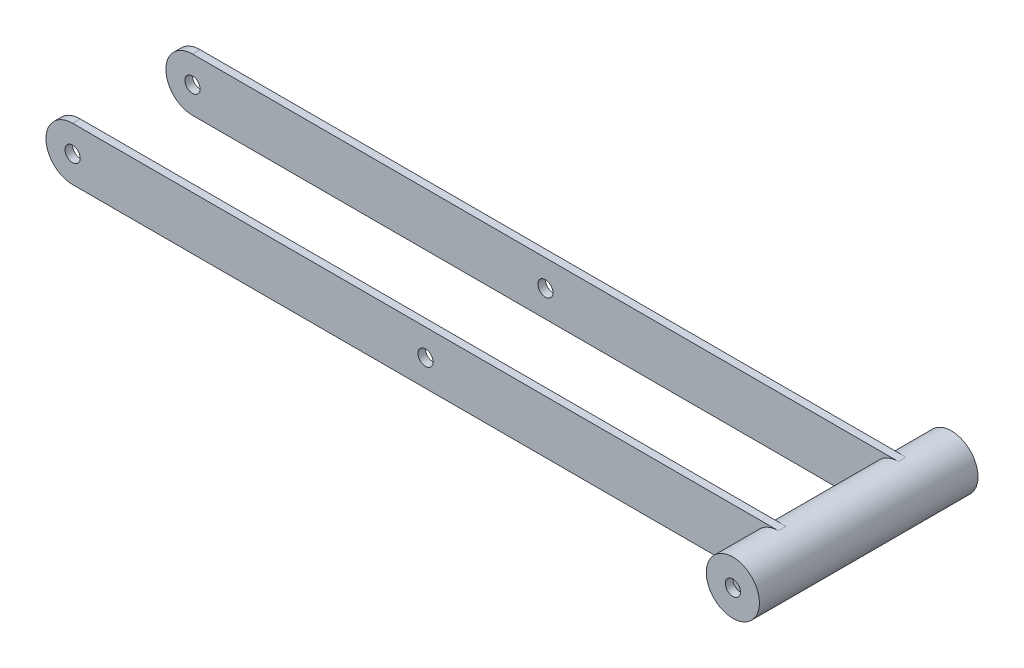
ISO-10303-21;
HEADER;
FILE_DESCRIPTION(('STEP AP214'),'2;1');
FILE_NAME('part.step','',(''),(''),'','','');
FILE_SCHEMA(('AUTOMOTIVE_DESIGN { 1 0 10303 214 1 1 1 1 }'));
ENDSEC;
DATA;
#1=APPLICATION_CONTEXT('core data for automotive mechanical design processes');
#2=APPLICATION_PROTOCOL_DEFINITION('international standard','automotive_design',2000,#1);
#3=PRODUCT_CONTEXT('',#1,'mechanical');
#4=PRODUCT('Part','Part','',(#3));
#5=PRODUCT_RELATED_PRODUCT_CATEGORY('part','',(#4));
#6=PRODUCT_DEFINITION_FORMATION('','',#4);
#7=PRODUCT_DEFINITION_CONTEXT('part definition',#1,'design');
#8=PRODUCT_DEFINITION('design','',#6,#7);
#9=PRODUCT_DEFINITION_SHAPE('','',#8);
#10=(LENGTH_UNIT() NAMED_UNIT(*) SI_UNIT(.MILLI.,.METRE.));
#11=(NAMED_UNIT(*) PLANE_ANGLE_UNIT() SI_UNIT($,.RADIAN.));
#12=(NAMED_UNIT(*) SI_UNIT($,.STERADIAN.) SOLID_ANGLE_UNIT());
#13=UNCERTAINTY_MEASURE_WITH_UNIT(LENGTH_MEASURE(1.E-05),#10,'distance_accuracy_value','');
#14=(GEOMETRIC_REPRESENTATION_CONTEXT(3) GLOBAL_UNCERTAINTY_ASSIGNED_CONTEXT((#13)) GLOBAL_UNIT_ASSIGNED_CONTEXT((#10,
#11,#12)) REPRESENTATION_CONTEXT('',''));
#15=CARTESIAN_POINT('',(0.,0.,0.));
#16=DIRECTION('',(0.,0.,1.));
#17=DIRECTION('',(1.,0.,0.));
#18=AXIS2_PLACEMENT_3D('',#15,#16,#17);
#19=CARTESIAN_POINT('',(-250.,-17.5,37.));
#20=DIRECTION('',(0.,0.,1.));
#21=DIRECTION('',(1.,0.,0.));
#22=AXIS2_PLACEMENT_3D('',#19,#20,#21);
#23=PLANE('',#22);
#24=CARTESIAN_POINT('',(-232.5,0.,37.));
#25=DIRECTION('',(0.,0.,1.));
#26=DIRECTION('',(1.,0.,0.));
#27=AXIS2_PLACEMENT_3D('',#24,#25,#26);
#28=CIRCLE('',#27,4.99999999999999);
#29=CARTESIAN_POINT('',(-237.5,0.,37.));
#30=VERTEX_POINT('',#29);
#31=EDGE_CURVE('E113',#30,#30,#28,.T.);
#32=ORIENTED_EDGE('',*,*,#31,.T.);
#33=EDGE_LOOP('',(#32));
#34=FACE_BOUND('',#33,.T.);
#35=CARTESIAN_POINT('',(0.,0.,37.));
#36=DIRECTION('',(0.,0.,1.));
#37=DIRECTION('',(1.,0.,0.));
#38=AXIS2_PLACEMENT_3D('',#35,#36,#37);
#39=CIRCLE('',#38,5.);
#40=CARTESIAN_POINT('',(-5.,0.,37.));
#41=VERTEX_POINT('',#40);
#42=EDGE_CURVE('E118',#41,#41,#39,.T.);
#43=ORIENTED_EDGE('',*,*,#42,.T.);
#44=EDGE_LOOP('',(#43));
#45=FACE_BOUND('',#44,.T.);
#46=CARTESIAN_POINT('',(232.5,0.,37.));
#47=DIRECTION('',(0.,0.,1.));
#48=DIRECTION('',(1.,0.,0.));
#49=AXIS2_PLACEMENT_3D('',#46,#47,#48);
#50=CIRCLE('',#49,17.5);
#51=CARTESIAN_POINT('',(232.5,-17.5,37.));
#52=VERTEX_POINT('',#51);
#53=CARTESIAN_POINT('',(232.5,17.5,37.));
#54=VERTEX_POINT('',#53);
#55=EDGE_CURVE('E70',#52,#54,#50,.F.);
#56=ORIENTED_EDGE('',*,*,#55,.F.);
#57=DIRECTION('',(1.,0.,0.));
#58=VECTOR('',#57,1.);
#59=CARTESIAN_POINT('',(-250.,-17.5,37.));
#60=LINE('',#59,#58);
#61=CARTESIAN_POINT('',(-232.5,-17.5,37.));
#62=VERTEX_POINT('',#61);
#63=EDGE_CURVE('E108',#62,#52,#60,.T.);
#64=ORIENTED_EDGE('',*,*,#63,.F.);
#65=CARTESIAN_POINT('',(-232.5,0.,37.));
#66=DIRECTION('',(0.,0.,1.));
#67=DIRECTION('',(1.,0.,0.));
#68=AXIS2_PLACEMENT_3D('',#65,#66,#67);
#69=CIRCLE('',#68,17.5);
#70=CARTESIAN_POINT('',(-250.,0.,37.));
#71=VERTEX_POINT('',#70);
#72=EDGE_CURVE('E201',#62,#71,#69,.F.);
#73=ORIENTED_EDGE('',*,*,#72,.T.);
#74=CARTESIAN_POINT('',(-232.5,0.,37.));
#75=DIRECTION('',(0.,0.,1.));
#76=DIRECTION('',(1.,0.,0.));
#77=AXIS2_PLACEMENT_3D('',#74,#75,#76);
#78=CIRCLE('',#77,17.5);
#79=CARTESIAN_POINT('',(-232.5,17.5,37.));
#80=VERTEX_POINT('',#79);
#81=EDGE_CURVE('E203',#71,#80,#78,.F.);
#82=ORIENTED_EDGE('',*,*,#81,.T.);
#83=DIRECTION('',(1.,0.,0.));
#84=VECTOR('',#83,1.);
#85=CARTESIAN_POINT('',(-250.,17.5,37.));
#86=LINE('',#85,#84);
#87=EDGE_CURVE('E57',#80,#54,#86,.T.);
#88=ORIENTED_EDGE('',*,*,#87,.T.);
#89=EDGE_LOOP('',(#56,#64,#73,#82,#88));
#90=FACE_BOUND('',#89,.T.);
#91=ADVANCED_FACE('F33',(#34,#45,#90),#23,.F.);
#92=CARTESIAN_POINT('',(0.,17.5,0.));
#93=DIRECTION('',(0.,1.,0.));
#94=DIRECTION('',(0.,0.,1.));
#95=AXIS2_PLACEMENT_3D('',#92,#93,#94);
#96=PLANE('',#95);
#97=ORIENTED_EDGE('',*,*,#87,.F.);
#98=DIRECTION('',(0.,0.,1.));
#99=VECTOR('',#98,1.);
#100=CARTESIAN_POINT('',(-232.5,17.5,42.));
#101=LINE('',#100,#99);
#102=CARTESIAN_POINT('',(-232.5,17.5,42.));
#103=VERTEX_POINT('',#102);
#104=EDGE_CURVE('E116',#80,#103,#101,.T.);
#105=ORIENTED_EDGE('',*,*,#104,.T.);
#106=DIRECTION('',(1.,0.,0.));
#107=VECTOR('',#106,1.);
#108=CARTESIAN_POINT('',(-250.,17.5,42.));
#109=LINE('',#108,#107);
#110=CARTESIAN_POINT('',(232.5,17.5,42.));
#111=VERTEX_POINT('',#110);
#112=EDGE_CURVE('E207',#103,#111,#109,.T.);
#113=ORIENTED_EDGE('',*,*,#112,.T.);
#114=DIRECTION('',(0.,0.,1.));
#115=VECTOR('',#114,1.);
#116=CARTESIAN_POINT('',(232.5,17.5,0.));
#117=LINE('',#116,#115);
#118=EDGE_CURVE('E210',#111,#54,#117,.F.);
#119=ORIENTED_EDGE('',*,*,#118,.T.);
#120=EDGE_LOOP('',(#97,#105,#113,#119));
#121=FACE_BOUND('',#120,.T.);
#122=ADVANCED_FACE('F35',(#121),#96,.T.);
#123=CARTESIAN_POINT('',(0.,-17.5,0.));
#124=DIRECTION('',(0.,1.,0.));
#125=DIRECTION('',(0.,0.,1.));
#126=AXIS2_PLACEMENT_3D('',#123,#124,#125);
#127=PLANE('',#126);
#128=DIRECTION('',(0.,0.,1.));
#129=VECTOR('',#128,1.);
#130=CARTESIAN_POINT('',(-232.5,-17.5,0.));
#131=LINE('',#130,#129);
#132=CARTESIAN_POINT('',(-232.5,-17.5,42.));
#133=VERTEX_POINT('',#132);
#134=EDGE_CURVE('E111',#133,#62,#131,.F.);
#135=ORIENTED_EDGE('',*,*,#134,.T.);
#136=ORIENTED_EDGE('',*,*,#63,.T.);
#137=DIRECTION('',(0.,0.,1.));
#138=VECTOR('',#137,1.);
#139=CARTESIAN_POINT('',(232.5,-17.5,42.));
#140=LINE('',#139,#138);
#141=CARTESIAN_POINT('',(232.5,-17.5,42.));
#142=VERTEX_POINT('',#141);
#143=EDGE_CURVE('E102',#52,#142,#140,.T.);
#144=ORIENTED_EDGE('',*,*,#143,.T.);
#145=DIRECTION('',(1.,0.,0.));
#146=VECTOR('',#145,1.);
#147=CARTESIAN_POINT('',(-250.,-17.5,42.));
#148=LINE('',#147,#146);
#149=EDGE_CURVE('E105',#133,#142,#148,.T.);
#150=ORIENTED_EDGE('',*,*,#149,.F.);
#151=EDGE_LOOP('',(#135,#136,#144,#150));
#152=FACE_BOUND('',#151,.T.);
#153=ADVANCED_FACE('F229',(#152),#127,.F.);
#154=CARTESIAN_POINT('',(232.5,0.,-42.));
#155=DIRECTION('',(0.,0.,1.));
#156=DIRECTION('',(1.,0.,0.));
#157=AXIS2_PLACEMENT_3D('',#154,#155,#156);
#158=CYLINDRICAL_SURFACE('',#157,17.5);
#159=DIRECTION('',(0.,0.,1.));
#160=VECTOR('',#159,1.);
#161=CARTESIAN_POINT('',(232.5,-17.5,42.));
#162=LINE('',#161,#160);
#163=CARTESIAN_POINT('',(232.5,-17.5,-42.));
#164=VERTEX_POINT('',#163);
#165=CARTESIAN_POINT('',(232.5,-17.5,-37.));
#166=VERTEX_POINT('',#165);
#167=EDGE_CURVE('E48',#164,#166,#162,.T.);
#168=ORIENTED_EDGE('',*,*,#167,.F.);
#169=CARTESIAN_POINT('',(232.5,0.,-42.));
#170=DIRECTION('',(0.,0.,-1.));
#171=DIRECTION('',(-1.,0.,0.));
#172=AXIS2_PLACEMENT_3D('',#169,#170,#171);
#173=CIRCLE('',#172,17.5);
#174=CARTESIAN_POINT('',(232.5,17.5,-42.));
#175=VERTEX_POINT('',#174);
#176=EDGE_CURVE('E11',#175,#164,#173,.F.);
#177=ORIENTED_EDGE('',*,*,#176,.F.);
#178=DIRECTION('',(0.,0.,1.));
#179=VECTOR('',#178,1.);
#180=CARTESIAN_POINT('',(232.5,17.5,0.));
#181=LINE('',#180,#179);
#182=CARTESIAN_POINT('',(232.5,17.5,-37.));
#183=VERTEX_POINT('',#182);
#184=EDGE_CURVE('E131',#183,#175,#181,.F.);
#185=ORIENTED_EDGE('',*,*,#184,.F.);
#186=CARTESIAN_POINT('',(232.5,0.,-37.));
#187=DIRECTION('',(0.,0.,-1.));
#188=DIRECTION('',(-1.,0.,0.));
#189=AXIS2_PLACEMENT_3D('',#186,#187,#188);
#190=CIRCLE('',#189,17.5);
#191=EDGE_CURVE('E41',#183,#166,#190,.F.);
#192=ORIENTED_EDGE('',*,*,#191,.T.);
#193=EDGE_LOOP('',(#168,#177,#185,#192));
#194=FACE_BOUND('',#193,.T.);
#195=CARTESIAN_POINT('',(232.5,0.,-72.));
#196=DIRECTION('',(0.,0.,1.));
#197=DIRECTION('',(1.,0.,0.));
#198=AXIS2_PLACEMENT_3D('',#195,#196,#197);
#199=CIRCLE('',#198,17.5);
#200=CARTESIAN_POINT('',(250.,0.,-72.));
#201=VERTEX_POINT('',#200);
#202=EDGE_CURVE('E183',#201,#201,#199,.T.);
#203=ORIENTED_EDGE('',*,*,#202,.T.);
#204=EDGE_LOOP('',(#203));
#205=FACE_BOUND('',#204,.T.);
#206=CARTESIAN_POINT('',(232.5,0.,72.));
#207=DIRECTION('',(0.,0.,1.));
#208=DIRECTION('',(1.,0.,0.));
#209=AXIS2_PLACEMENT_3D('',#206,#207,#208);
#210=CIRCLE('',#209,17.5);
#211=CARTESIAN_POINT('',(250.,0.,72.));
#212=VERTEX_POINT('',#211);
#213=EDGE_CURVE('E189',#212,#212,#210,.T.);
#214=ORIENTED_EDGE('',*,*,#213,.F.);
#215=EDGE_LOOP('',(#214));
#216=FACE_BOUND('',#215,.T.);
#217=CARTESIAN_POINT('',(232.5,0.,42.));
#218=DIRECTION('',(0.,0.,-1.));
#219=DIRECTION('',(-1.,0.,0.));
#220=AXIS2_PLACEMENT_3D('',#217,#218,#219);
#221=CIRCLE('',#220,17.5);
#222=EDGE_CURVE('E192',#111,#142,#221,.F.);
#223=ORIENTED_EDGE('',*,*,#222,.T.);
#224=ORIENTED_EDGE('',*,*,#143,.F.);
#225=ORIENTED_EDGE('',*,*,#55,.T.);
#226=ORIENTED_EDGE('',*,*,#118,.F.);
#227=EDGE_LOOP('',(#223,#224,#225,#226));
#228=FACE_BOUND('',#227,.T.);
#229=DIRECTION('',(0.,0.,1.));
#230=VECTOR('',#229,1.);
#231=CARTESIAN_POINT('',(250.,0.,-42.));
#232=LINE('',#231,#230);
#233=CARTESIAN_POINT('',(250.,0.,37.));
#234=VERTEX_POINT('',#233);
#235=CARTESIAN_POINT('',(250.,0.,42.));
#236=VERTEX_POINT('',#235);
#237=EDGE_CURVE('E98',#234,#236,#232,.T.);
#238=ORIENTED_EDGE('',*,*,#237,.T.);
#239=ORIENTED_EDGE('',*,*,#237,.F.);
#240=EDGE_LOOP('',(#238,#239));
#241=FACE_BOUND('',#240,.T.);
#242=ADVANCED_FACE('F99',(#194,#205,#216,#228,#241),#158,.T.);
#243=CARTESIAN_POINT('',(-232.5,0.,0.));
#244=DIRECTION('',(0.,0.,-1.));
#245=DIRECTION('',(-1.,0.,0.));
#246=AXIS2_PLACEMENT_3D('',#243,#244,#245);
#247=CYLINDRICAL_SURFACE('',#246,17.5);
#248=ORIENTED_EDGE('',*,*,#81,.F.);
#249=DIRECTION('',(0.,0.,1.));
#250=VECTOR('',#249,1.);
#251=CARTESIAN_POINT('',(-250.,0.,-42.));
#252=LINE('',#251,#250);
#253=CARTESIAN_POINT('',(-250.,0.,42.));
#254=VERTEX_POINT('',#253);
#255=EDGE_CURVE('E101',#254,#71,#252,.F.);
#256=ORIENTED_EDGE('',*,*,#255,.F.);
#257=CARTESIAN_POINT('',(-232.5,0.,42.));
#258=DIRECTION('',(0.,0.,-1.));
#259=DIRECTION('',(-1.,0.,0.));
#260=AXIS2_PLACEMENT_3D('',#257,#258,#259);
#261=CIRCLE('',#260,17.5);
#262=EDGE_CURVE('E85',#103,#254,#261,.F.);
#263=ORIENTED_EDGE('',*,*,#262,.F.);
#264=ORIENTED_EDGE('',*,*,#104,.F.);
#265=EDGE_LOOP('',(#248,#256,#263,#264));
#266=FACE_BOUND('',#265,.T.);
#267=ADVANCED_FACE('F222',(#266),#247,.T.);
#268=CARTESIAN_POINT('',(-232.5,0.,-42.));
#269=DIRECTION('',(0.,0.,1.));
#270=DIRECTION('',(1.,0.,0.));
#271=AXIS2_PLACEMENT_3D('',#268,#269,#270);
#272=CYLINDRICAL_SURFACE('',#271,17.5);
#273=ORIENTED_EDGE('',*,*,#72,.F.);
#274=ORIENTED_EDGE('',*,*,#134,.F.);
#275=CARTESIAN_POINT('',(-232.5,0.,42.));
#276=DIRECTION('',(0.,0.,-1.));
#277=DIRECTION('',(-1.,0.,0.));
#278=AXIS2_PLACEMENT_3D('',#275,#276,#277);
#279=CIRCLE('',#278,17.5);
#280=EDGE_CURVE('E79',#254,#133,#279,.F.);
#281=ORIENTED_EDGE('',*,*,#280,.F.);
#282=ORIENTED_EDGE('',*,*,#255,.T.);
#283=EDGE_LOOP('',(#273,#274,#281,#282));
#284=FACE_BOUND('',#283,.T.);
#285=ADVANCED_FACE('F226',(#284),#272,.T.);
#286=CARTESIAN_POINT('',(-250.,17.5,42.));
#287=DIRECTION('',(0.,0.,-1.));
#288=DIRECTION('',(-1.,0.,0.));
#289=AXIS2_PLACEMENT_3D('',#286,#287,#288);
#290=PLANE('',#289);
#291=ORIENTED_EDGE('',*,*,#222,.F.);
#292=ORIENTED_EDGE('',*,*,#112,.F.);
#293=ORIENTED_EDGE('',*,*,#262,.T.);
#294=ORIENTED_EDGE('',*,*,#280,.T.);
#295=ORIENTED_EDGE('',*,*,#149,.T.);
#296=EDGE_LOOP('',(#291,#292,#293,#294,#295));
#297=FACE_BOUND('',#296,.T.);
#298=CARTESIAN_POINT('',(0.,0.,42.));
#299=DIRECTION('',(0.,0.,-1.));
#300=DIRECTION('',(-1.,0.,0.));
#301=AXIS2_PLACEMENT_3D('',#298,#299,#300);
#302=CIRCLE('',#301,5.);
#303=CARTESIAN_POINT('',(-5.,0.,42.));
#304=VERTEX_POINT('',#303);
#305=EDGE_CURVE('E121',#304,#304,#302,.T.);
#306=ORIENTED_EDGE('',*,*,#305,.T.);
#307=EDGE_LOOP('',(#306));
#308=FACE_BOUND('',#307,.T.);
#309=CARTESIAN_POINT('',(-232.5,0.,42.));
#310=DIRECTION('',(0.,0.,-1.));
#311=DIRECTION('',(-1.,0.,0.));
#312=AXIS2_PLACEMENT_3D('',#309,#310,#311);
#313=CIRCLE('',#312,4.99999999999999);
#314=CARTESIAN_POINT('',(-237.5,0.,42.));
#315=VERTEX_POINT('',#314);
#316=EDGE_CURVE('E117',#315,#315,#313,.T.);
#317=ORIENTED_EDGE('',*,*,#316,.T.);
#318=EDGE_LOOP('',(#317));
#319=FACE_BOUND('',#318,.T.);
#320=ADVANCED_FACE('F220',(#297,#308,#319),#290,.F.);
#321=CARTESIAN_POINT('',(-232.5,0.,42.));
#322=DIRECTION('',(0.,0.,-1.));
#323=DIRECTION('',(-1.,0.,0.));
#324=AXIS2_PLACEMENT_3D('',#321,#322,#323);
#325=CYLINDRICAL_SURFACE('',#324,4.99999999999999);
#326=CARTESIAN_POINT('',(-237.5,0.,42.));
#327=CARTESIAN_POINT('',(-237.5,0.,41.9479166666667));
#328=CARTESIAN_POINT('',(-237.5,0.,41.8958333333333));
#329=CARTESIAN_POINT('',(-237.5,0.,41.7916666666667));
#330=CARTESIAN_POINT('',(-237.5,0.,41.7395833333333));
#331=CARTESIAN_POINT('',(-237.5,0.,41.6354166666667));
#332=CARTESIAN_POINT('',(-237.5,0.,41.5833333333333));
#333=CARTESIAN_POINT('',(-237.5,0.,41.4791666666667));
#334=CARTESIAN_POINT('',(-237.5,0.,41.4270833333333));
#335=CARTESIAN_POINT('',(-237.5,0.,41.3229166666667));
#336=CARTESIAN_POINT('',(-237.5,0.,41.2708333333333));
#337=CARTESIAN_POINT('',(-237.5,0.,41.1666666666667));
#338=CARTESIAN_POINT('',(-237.5,0.,41.1145833333333));
#339=CARTESIAN_POINT('',(-237.5,0.,41.0104166666667));
#340=CARTESIAN_POINT('',(-237.5,0.,40.9583333333333));
#341=CARTESIAN_POINT('',(-237.5,0.,40.8541666666667));
#342=CARTESIAN_POINT('',(-237.5,0.,40.8020833333333));
#343=CARTESIAN_POINT('',(-237.5,0.,40.6979166666667));
#344=CARTESIAN_POINT('',(-237.5,0.,40.6458333333333));
#345=CARTESIAN_POINT('',(-237.5,0.,40.5416666666667));
#346=CARTESIAN_POINT('',(-237.5,0.,40.4895833333333));
#347=CARTESIAN_POINT('',(-237.5,0.,40.3854166666667));
#348=CARTESIAN_POINT('',(-237.5,0.,40.3333333333333));
#349=CARTESIAN_POINT('',(-237.5,0.,40.2291666666667));
#350=CARTESIAN_POINT('',(-237.5,0.,40.1770833333333));
#351=CARTESIAN_POINT('',(-237.5,0.,40.0729166666667));
#352=CARTESIAN_POINT('',(-237.5,0.,40.0208333333333));
#353=CARTESIAN_POINT('',(-237.5,0.,39.9166666666667));
#354=CARTESIAN_POINT('',(-237.5,0.,39.8645833333333));
#355=CARTESIAN_POINT('',(-237.5,0.,39.7604166666667));
#356=CARTESIAN_POINT('',(-237.5,0.,39.7083333333333));
#357=CARTESIAN_POINT('',(-237.5,0.,39.6041666666667));
#358=CARTESIAN_POINT('',(-237.5,0.,39.5520833333333));
#359=CARTESIAN_POINT('',(-237.5,0.,39.4479166666667));
#360=CARTESIAN_POINT('',(-237.5,0.,39.3958333333333));
#361=CARTESIAN_POINT('',(-237.5,0.,39.2916666666667));
#362=CARTESIAN_POINT('',(-237.5,0.,39.2395833333333));
#363=CARTESIAN_POINT('',(-237.5,0.,39.1354166666667));
#364=CARTESIAN_POINT('',(-237.5,0.,39.0833333333333));
#365=CARTESIAN_POINT('',(-237.5,0.,38.9791666666667));
#366=CARTESIAN_POINT('',(-237.5,0.,38.9270833333333));
#367=CARTESIAN_POINT('',(-237.5,0.,38.8229166666667));
#368=CARTESIAN_POINT('',(-237.5,0.,38.7708333333333));
#369=CARTESIAN_POINT('',(-237.5,0.,38.6666666666667));
#370=CARTESIAN_POINT('',(-237.5,0.,38.6145833333333));
#371=CARTESIAN_POINT('',(-237.5,0.,38.5104166666667));
#372=CARTESIAN_POINT('',(-237.5,0.,38.4583333333333));
#373=CARTESIAN_POINT('',(-237.5,0.,38.3541666666667));
#374=CARTESIAN_POINT('',(-237.5,0.,38.3020833333333));
#375=CARTESIAN_POINT('',(-237.5,0.,38.1979166666667));
#376=CARTESIAN_POINT('',(-237.5,0.,38.1458333333333));
#377=CARTESIAN_POINT('',(-237.5,0.,38.0416666666667));
#378=CARTESIAN_POINT('',(-237.5,0.,37.9895833333333));
#379=CARTESIAN_POINT('',(-237.5,0.,37.8854166666667));
#380=CARTESIAN_POINT('',(-237.5,0.,37.8333333333333));
#381=CARTESIAN_POINT('',(-237.5,0.,37.7291666666667));
#382=CARTESIAN_POINT('',(-237.5,0.,37.6770833333333));
#383=CARTESIAN_POINT('',(-237.5,0.,37.5729166666667));
#384=CARTESIAN_POINT('',(-237.5,0.,37.5208333333333));
#385=CARTESIAN_POINT('',(-237.5,0.,37.4166666666667));
#386=CARTESIAN_POINT('',(-237.5,0.,37.3645833333333));
#387=CARTESIAN_POINT('',(-237.5,0.,37.2604166666667));
#388=CARTESIAN_POINT('',(-237.5,0.,37.2083333333333));
#389=CARTESIAN_POINT('',(-237.5,0.,37.1041666666667));
#390=CARTESIAN_POINT('',(-237.5,0.,37.0520833333333));
#391=CARTESIAN_POINT('',(-237.5,0.,37.));
#392=B_SPLINE_CURVE_WITH_KNOTS('',3,(#326,#327,#328,#329,#330,#331,#332,#333,#334,#335,#336,
#337,#338,#339,#340,#341,#342,#343,#344,#345,#346,#347,#348,#349,#350,#351,#352,#353,#354,#355,
#356,#357,#358,#359,#360,#361,#362,#363,#364,#365,#366,#367,#368,#369,#370,#371,#372,#373,#374,
#375,#376,#377,#378,#379,#380,#381,#382,#383,#384,#385,#386,#387,#388,#389,#390,#391),
.UNSPECIFIED.,.F.,.F.,(4,2,2,2,2,2,2,2,2,2,2,2,2,2,2,2,2,2,2,2,2,2,2,2,2,2,2,2,2,2,2,2,4),(0.,
0.156249999999997,0.3125,0.468749999999997,0.625000000000001,0.781249999999997,
0.937500000000001,1.09375,1.25,1.40625,1.5625,1.71875,1.875,2.03125,2.1875,2.34375,2.5,2.65625,
2.8125,2.96875,3.125,3.28125,3.4375,3.59375,3.75,3.90625,4.0625,4.21875,4.375,4.53125,4.6875,
4.84375,5.),.UNSPECIFIED.);
#393=EDGE_CURVE('BSEAM305',#315,#30,#392,.T.);
#394=ORIENTED_EDGE('',*,*,#316,.F.);
#395=ORIENTED_EDGE('',*,*,#31,.F.);
#396=ORIENTED_EDGE('',*,*,#393,.T.);
#397=ORIENTED_EDGE('',*,*,#393,.F.);
#398=EDGE_LOOP('',(#394,#396,#395,#397));
#399=FACE_BOUND('',#398,.T.);
#400=ADVANCED_FACE('F305',(#399),#325,.F.);
#401=CARTESIAN_POINT('',(0.,0.,42.));
#402=DIRECTION('',(0.,0.,-1.));
#403=DIRECTION('',(-1.,0.,0.));
#404=AXIS2_PLACEMENT_3D('',#401,#402,#403);
#405=CYLINDRICAL_SURFACE('',#404,5.);
#406=CARTESIAN_POINT('',(-5.,0.,42.));
#407=CARTESIAN_POINT('',(-5.,0.,41.9479166666667));
#408=CARTESIAN_POINT('',(-5.,0.,41.8958333333333));
#409=CARTESIAN_POINT('',(-5.,0.,41.7916666666667));
#410=CARTESIAN_POINT('',(-5.,0.,41.7395833333333));
#411=CARTESIAN_POINT('',(-5.,0.,41.6354166666667));
#412=CARTESIAN_POINT('',(-5.,0.,41.5833333333333));
#413=CARTESIAN_POINT('',(-5.,0.,41.4791666666667));
#414=CARTESIAN_POINT('',(-5.,0.,41.4270833333333));
#415=CARTESIAN_POINT('',(-5.,0.,41.3229166666667));
#416=CARTESIAN_POINT('',(-5.,0.,41.2708333333333));
#417=CARTESIAN_POINT('',(-5.,0.,41.1666666666667));
#418=CARTESIAN_POINT('',(-5.,0.,41.1145833333333));
#419=CARTESIAN_POINT('',(-5.,0.,41.0104166666667));
#420=CARTESIAN_POINT('',(-5.,0.,40.9583333333333));
#421=CARTESIAN_POINT('',(-5.,0.,40.8541666666667));
#422=CARTESIAN_POINT('',(-5.,0.,40.8020833333333));
#423=CARTESIAN_POINT('',(-5.,0.,40.6979166666667));
#424=CARTESIAN_POINT('',(-5.,0.,40.6458333333333));
#425=CARTESIAN_POINT('',(-5.,0.,40.5416666666667));
#426=CARTESIAN_POINT('',(-5.,0.,40.4895833333333));
#427=CARTESIAN_POINT('',(-5.,0.,40.3854166666667));
#428=CARTESIAN_POINT('',(-5.,0.,40.3333333333333));
#429=CARTESIAN_POINT('',(-5.,0.,40.2291666666667));
#430=CARTESIAN_POINT('',(-5.,0.,40.1770833333333));
#431=CARTESIAN_POINT('',(-5.,0.,40.0729166666667));
#432=CARTESIAN_POINT('',(-5.,0.,40.0208333333333));
#433=CARTESIAN_POINT('',(-5.,0.,39.9166666666667));
#434=CARTESIAN_POINT('',(-5.,0.,39.8645833333333));
#435=CARTESIAN_POINT('',(-5.,0.,39.7604166666667));
#436=CARTESIAN_POINT('',(-5.,0.,39.7083333333333));
#437=CARTESIAN_POINT('',(-5.,0.,39.6041666666667));
#438=CARTESIAN_POINT('',(-5.,0.,39.5520833333333));
#439=CARTESIAN_POINT('',(-5.,0.,39.4479166666667));
#440=CARTESIAN_POINT('',(-5.,0.,39.3958333333333));
#441=CARTESIAN_POINT('',(-5.,0.,39.2916666666667));
#442=CARTESIAN_POINT('',(-5.,0.,39.2395833333333));
#443=CARTESIAN_POINT('',(-5.,0.,39.1354166666667));
#444=CARTESIAN_POINT('',(-5.,0.,39.0833333333333));
#445=CARTESIAN_POINT('',(-5.,0.,38.9791666666667));
#446=CARTESIAN_POINT('',(-5.,0.,38.9270833333333));
#447=CARTESIAN_POINT('',(-5.,0.,38.8229166666667));
#448=CARTESIAN_POINT('',(-5.,0.,38.7708333333333));
#449=CARTESIAN_POINT('',(-5.,0.,38.6666666666667));
#450=CARTESIAN_POINT('',(-5.,0.,38.6145833333333));
#451=CARTESIAN_POINT('',(-5.,0.,38.5104166666667));
#452=CARTESIAN_POINT('',(-5.,0.,38.4583333333333));
#453=CARTESIAN_POINT('',(-5.,0.,38.3541666666667));
#454=CARTESIAN_POINT('',(-5.,0.,38.3020833333333));
#455=CARTESIAN_POINT('',(-5.,0.,38.1979166666667));
#456=CARTESIAN_POINT('',(-5.,0.,38.1458333333333));
#457=CARTESIAN_POINT('',(-5.,0.,38.0416666666667));
#458=CARTESIAN_POINT('',(-5.,0.,37.9895833333333));
#459=CARTESIAN_POINT('',(-5.,0.,37.8854166666667));
#460=CARTESIAN_POINT('',(-5.,0.,37.8333333333333));
#461=CARTESIAN_POINT('',(-5.,0.,37.7291666666667));
#462=CARTESIAN_POINT('',(-5.,0.,37.6770833333333));
#463=CARTESIAN_POINT('',(-5.,0.,37.5729166666667));
#464=CARTESIAN_POINT('',(-5.,0.,37.5208333333333));
#465=CARTESIAN_POINT('',(-5.,0.,37.4166666666667));
#466=CARTESIAN_POINT('',(-5.,0.,37.3645833333333));
#467=CARTESIAN_POINT('',(-5.,0.,37.2604166666667));
#468=CARTESIAN_POINT('',(-5.,0.,37.2083333333333));
#469=CARTESIAN_POINT('',(-5.,0.,37.1041666666667));
#470=CARTESIAN_POINT('',(-5.,0.,37.0520833333333));
#471=CARTESIAN_POINT('',(-5.,0.,37.));
#472=B_SPLINE_CURVE_WITH_KNOTS('',3,(#406,#407,#408,#409,#410,#411,#412,#413,#414,#415,#416,
#417,#418,#419,#420,#421,#422,#423,#424,#425,#426,#427,#428,#429,#430,#431,#432,#433,#434,#435,
#436,#437,#438,#439,#440,#441,#442,#443,#444,#445,#446,#447,#448,#449,#450,#451,#452,#453,#454,
#455,#456,#457,#458,#459,#460,#461,#462,#463,#464,#465,#466,#467,#468,#469,#470,#471),
.UNSPECIFIED.,.F.,.F.,(4,2,2,2,2,2,2,2,2,2,2,2,2,2,2,2,2,2,2,2,2,2,2,2,2,2,2,2,2,2,2,2,4),(0.,
0.156249999999997,0.3125,0.468749999999997,0.625000000000001,0.781249999999997,
0.937500000000001,1.09375,1.25,1.40625,1.5625,1.71875,1.875,2.03125,2.1875,2.34375,2.5,2.65625,
2.8125,2.96875,3.125,3.28125,3.4375,3.59375,3.75,3.90625,4.0625,4.21875,4.375,4.53125,4.6875,
4.84375,5.),.UNSPECIFIED.);
#473=EDGE_CURVE('BSEAM311',#304,#41,#472,.T.);
#474=ORIENTED_EDGE('',*,*,#305,.F.);
#475=ORIENTED_EDGE('',*,*,#42,.F.);
#476=ORIENTED_EDGE('',*,*,#473,.T.);
#477=ORIENTED_EDGE('',*,*,#473,.F.);
#478=EDGE_LOOP('',(#474,#476,#475,#477));
#479=FACE_BOUND('',#478,.T.);
#480=ADVANCED_FACE('F311',(#479),#405,.F.);
#481=CARTESIAN_POINT('',(232.5,0.,-72.));
#482=DIRECTION('',(0.,0.,1.));
#483=DIRECTION('',(1.,0.,0.));
#484=AXIS2_PLACEMENT_3D('',#481,#482,#483);
#485=PLANE('',#484);
#486=CARTESIAN_POINT('',(232.5,0.,-72.));
#487=DIRECTION('',(0.,0.,-1.));
#488=DIRECTION('',(-1.,0.,0.));
#489=AXIS2_PLACEMENT_3D('',#486,#487,#488);
#490=CIRCLE('',#489,4.99999999999999);
#491=CARTESIAN_POINT('',(227.5,0.,-72.));
#492=VERTEX_POINT('',#491);
#493=EDGE_CURVE('E471',#492,#492,#490,.T.);
#494=ORIENTED_EDGE('',*,*,#493,.F.);
#495=EDGE_LOOP('',(#494));
#496=FACE_BOUND('',#495,.T.);
#497=ORIENTED_EDGE('',*,*,#202,.F.);
#498=EDGE_LOOP('',(#497));
#499=FACE_BOUND('',#498,.T.);
#500=ADVANCED_FACE('F318',(#496,#499),#485,.F.);
#501=CARTESIAN_POINT('',(232.5,0.,72.));
#502=DIRECTION('',(0.,0.,1.));
#503=DIRECTION('',(1.,0.,0.));
#504=AXIS2_PLACEMENT_3D('',#501,#502,#503);
#505=PLANE('',#504);
#506=CARTESIAN_POINT('',(232.5,0.,72.));
#507=DIRECTION('',(0.,0.,-1.));
#508=DIRECTION('',(-1.,0.,0.));
#509=AXIS2_PLACEMENT_3D('',#506,#507,#508);
#510=CIRCLE('',#509,4.99999999999999);
#511=CARTESIAN_POINT('',(227.5,0.,72.));
#512=VERTEX_POINT('',#511);
#513=EDGE_CURVE('E472',#512,#512,#510,.T.);
#514=ORIENTED_EDGE('',*,*,#513,.T.);
#515=EDGE_LOOP('',(#514));
#516=FACE_BOUND('',#515,.T.);
#517=ORIENTED_EDGE('',*,*,#213,.T.);
#518=EDGE_LOOP('',(#517));
#519=FACE_BOUND('',#518,.T.);
#520=ADVANCED_FACE('F326',(#516,#519),#505,.T.);
#521=CARTESIAN_POINT('',(-250.,17.5,-42.));
#522=DIRECTION('',(0.,0.,-1.));
#523=DIRECTION('',(-1.,0.,0.));
#524=AXIS2_PLACEMENT_3D('',#521,#522,#523);
#525=PLANE('',#524);
#526=CARTESIAN_POINT('',(0.,0.,-42.));
#527=DIRECTION('',(0.,0.,-1.));
#528=DIRECTION('',(-1.,0.,0.));
#529=AXIS2_PLACEMENT_3D('',#526,#527,#528);
#530=CIRCLE('',#529,5.);
#531=CARTESIAN_POINT('',(-5.,0.,-42.));
#532=VERTEX_POINT('',#531);
#533=EDGE_CURVE('E188',#532,#532,#530,.T.);
#534=ORIENTED_EDGE('',*,*,#533,.F.);
#535=EDGE_LOOP('',(#534));
#536=FACE_BOUND('',#535,.T.);
#537=CARTESIAN_POINT('',(-232.5,0.,-42.));
#538=DIRECTION('',(0.,0.,-1.));
#539=DIRECTION('',(-1.,0.,0.));
#540=AXIS2_PLACEMENT_3D('',#537,#538,#539);
#541=CIRCLE('',#540,4.99999999999999);
#542=CARTESIAN_POINT('',(-237.5,0.,-42.));
#543=VERTEX_POINT('',#542);
#544=EDGE_CURVE('E158',#543,#543,#541,.T.);
#545=ORIENTED_EDGE('',*,*,#544,.F.);
#546=EDGE_LOOP('',(#545));
#547=FACE_BOUND('',#546,.T.);
#548=DIRECTION('',(1.,0.,0.));
#549=VECTOR('',#548,1.);
#550=CARTESIAN_POINT('',(-250.,17.5,-42.));
#551=LINE('',#550,#549);
#552=CARTESIAN_POINT('',(-232.5,17.5,-42.));
#553=VERTEX_POINT('',#552);
#554=EDGE_CURVE('E164',#553,#175,#551,.T.);
#555=ORIENTED_EDGE('',*,*,#554,.T.);
#556=ORIENTED_EDGE('',*,*,#176,.T.);
#557=DIRECTION('',(1.,0.,0.));
#558=VECTOR('',#557,1.);
#559=CARTESIAN_POINT('',(-250.,-17.5,-42.));
#560=LINE('',#559,#558);
#561=CARTESIAN_POINT('',(-232.5,-17.5,-42.));
#562=VERTEX_POINT('',#561);
#563=EDGE_CURVE('E167',#562,#164,#560,.T.);
#564=ORIENTED_EDGE('',*,*,#563,.F.);
#565=CARTESIAN_POINT('',(-232.5,0.,-42.));
#566=DIRECTION('',(0.,0.,-1.));
#567=DIRECTION('',(-1.,0.,0.));
#568=AXIS2_PLACEMENT_3D('',#565,#566,#567);
#569=CIRCLE('',#568,17.5);
#570=CARTESIAN_POINT('',(-250.,0.,-42.));
#571=VERTEX_POINT('',#570);
#572=EDGE_CURVE('E175',#562,#571,#569,.T.);
#573=ORIENTED_EDGE('',*,*,#572,.T.);
#574=CARTESIAN_POINT('',(-232.5,0.,-42.));
#575=DIRECTION('',(0.,0.,-1.));
#576=DIRECTION('',(-1.,0.,0.));
#577=AXIS2_PLACEMENT_3D('',#574,#575,#576);
#578=CIRCLE('',#577,17.5);
#579=EDGE_CURVE('E172',#571,#553,#578,.T.);
#580=ORIENTED_EDGE('',*,*,#579,.T.);
#581=EDGE_LOOP('',(#555,#556,#564,#573,#580));
#582=FACE_BOUND('',#581,.T.);
#583=ADVANCED_FACE('F254',(#536,#547,#582),#525,.T.);
#584=CARTESIAN_POINT('',(-232.5,0.,-42.));
#585=DIRECTION('',(0.,0.,1.));
#586=DIRECTION('',(1.,0.,0.));
#587=AXIS2_PLACEMENT_3D('',#584,#585,#586);
#588=CYLINDRICAL_SURFACE('',#587,17.5);
#589=CARTESIAN_POINT('',(-232.5,0.,-37.));
#590=DIRECTION('',(0.,0.,-1.));
#591=DIRECTION('',(-1.,0.,0.));
#592=AXIS2_PLACEMENT_3D('',#589,#590,#591);
#593=CIRCLE('',#592,17.5);
#594=CARTESIAN_POINT('',(-250.,0.,-37.));
#595=VERTEX_POINT('',#594);
#596=CARTESIAN_POINT('',(-232.5,-17.5,-37.));
#597=VERTEX_POINT('',#596);
#598=EDGE_CURVE('E180',#595,#597,#593,.F.);
#599=ORIENTED_EDGE('',*,*,#598,.F.);
#600=DIRECTION('',(0.,0.,1.));
#601=VECTOR('',#600,1.);
#602=CARTESIAN_POINT('',(-250.,0.,-42.));
#603=LINE('',#602,#601);
#604=EDGE_CURVE('E163',#595,#571,#603,.F.);
#605=ORIENTED_EDGE('',*,*,#604,.T.);
#606=ORIENTED_EDGE('',*,*,#572,.F.);
#607=DIRECTION('',(0.,0.,1.));
#608=VECTOR('',#607,1.);
#609=CARTESIAN_POINT('',(-232.5,-17.5,0.));
#610=LINE('',#609,#608);
#611=EDGE_CURVE('E166',#597,#562,#610,.F.);
#612=ORIENTED_EDGE('',*,*,#611,.F.);
#613=EDGE_LOOP('',(#599,#605,#606,#612));
#614=FACE_BOUND('',#613,.T.);
#615=ADVANCED_FACE('F250',(#614),#588,.T.);
#616=CARTESIAN_POINT('',(-232.5,0.,0.));
#617=DIRECTION('',(0.,0.,-1.));
#618=DIRECTION('',(-1.,0.,0.));
#619=AXIS2_PLACEMENT_3D('',#616,#617,#618);
#620=CYLINDRICAL_SURFACE('',#619,17.5);
#621=CARTESIAN_POINT('',(-232.5,0.,-37.));
#622=DIRECTION('',(0.,0.,-1.));
#623=DIRECTION('',(-1.,0.,0.));
#624=AXIS2_PLACEMENT_3D('',#621,#622,#623);
#625=CIRCLE('',#624,17.5);
#626=CARTESIAN_POINT('',(-232.5,17.5,-37.));
#627=VERTEX_POINT('',#626);
#628=EDGE_CURVE('E155',#627,#595,#625,.F.);
#629=ORIENTED_EDGE('',*,*,#628,.F.);
#630=DIRECTION('',(0.,0.,1.));
#631=VECTOR('',#630,1.);
#632=CARTESIAN_POINT('',(-232.5,17.5,42.));
#633=LINE('',#632,#631);
#634=EDGE_CURVE('E152',#553,#627,#633,.T.);
#635=ORIENTED_EDGE('',*,*,#634,.F.);
#636=ORIENTED_EDGE('',*,*,#579,.F.);
#637=ORIENTED_EDGE('',*,*,#604,.F.);
#638=EDGE_LOOP('',(#629,#635,#636,#637));
#639=FACE_BOUND('',#638,.T.);
#640=ADVANCED_FACE('F256',(#639),#620,.T.);
#641=CARTESIAN_POINT('',(0.,-17.5,0.));
#642=DIRECTION('',(0.,1.,0.));
#643=DIRECTION('',(0.,0.,1.));
#644=AXIS2_PLACEMENT_3D('',#641,#642,#643);
#645=PLANE('',#644);
#646=ORIENTED_EDGE('',*,*,#167,.T.);
#647=DIRECTION('',(-1.,0.,0.));
#648=VECTOR('',#647,1.);
#649=CARTESIAN_POINT('',(-250.,-17.5,-37.));
#650=LINE('',#649,#648);
#651=EDGE_CURVE('E142',#166,#597,#650,.T.);
#652=ORIENTED_EDGE('',*,*,#651,.T.);
#653=ORIENTED_EDGE('',*,*,#611,.T.);
#654=ORIENTED_EDGE('',*,*,#563,.T.);
#655=EDGE_LOOP('',(#646,#652,#653,#654));
#656=FACE_BOUND('',#655,.T.);
#657=ADVANCED_FACE('F248',(#656),#645,.F.);
#658=CARTESIAN_POINT('',(0.,17.5,0.));
#659=DIRECTION('',(0.,1.,0.));
#660=DIRECTION('',(0.,0.,1.));
#661=AXIS2_PLACEMENT_3D('',#658,#659,#660);
#662=PLANE('',#661);
#663=DIRECTION('',(-1.,0.,0.));
#664=VECTOR('',#663,1.);
#665=CARTESIAN_POINT('',(-250.,17.5,-37.));
#666=LINE('',#665,#664);
#667=EDGE_CURVE('E139',#183,#627,#666,.T.);
#668=ORIENTED_EDGE('',*,*,#667,.F.);
#669=ORIENTED_EDGE('',*,*,#184,.T.);
#670=ORIENTED_EDGE('',*,*,#554,.F.);
#671=ORIENTED_EDGE('',*,*,#634,.T.);
#672=EDGE_LOOP('',(#668,#669,#670,#671));
#673=FACE_BOUND('',#672,.T.);
#674=ADVANCED_FACE('F147',(#673),#662,.T.);
#675=CARTESIAN_POINT('',(-250.,-17.5,-37.));
#676=DIRECTION('',(0.,0.,-1.));
#677=DIRECTION('',(-1.,0.,0.));
#678=AXIS2_PLACEMENT_3D('',#675,#676,#677);
#679=PLANE('',#678);
#680=ORIENTED_EDGE('',*,*,#191,.F.);
#681=ORIENTED_EDGE('',*,*,#667,.T.);
#682=ORIENTED_EDGE('',*,*,#628,.T.);
#683=ORIENTED_EDGE('',*,*,#598,.T.);
#684=ORIENTED_EDGE('',*,*,#651,.F.);
#685=EDGE_LOOP('',(#680,#681,#682,#683,#684));
#686=FACE_BOUND('',#685,.T.);
#687=CARTESIAN_POINT('',(0.,0.,-37.));
#688=DIRECTION('',(0.,0.,-1.));
#689=DIRECTION('',(-1.,0.,0.));
#690=AXIS2_PLACEMENT_3D('',#687,#688,#689);
#691=CIRCLE('',#690,5.);
#692=CARTESIAN_POINT('',(-5.,0.,-37.));
#693=VERTEX_POINT('',#692);
#694=EDGE_CURVE('E185',#693,#693,#691,.T.);
#695=ORIENTED_EDGE('',*,*,#694,.T.);
#696=EDGE_LOOP('',(#695));
#697=FACE_BOUND('',#696,.T.);
#698=CARTESIAN_POINT('',(-232.5,0.,-37.));
#699=DIRECTION('',(0.,0.,-1.));
#700=DIRECTION('',(-1.,0.,0.));
#701=AXIS2_PLACEMENT_3D('',#698,#699,#700);
#702=CIRCLE('',#701,4.99999999999999);
#703=CARTESIAN_POINT('',(-237.5,0.,-37.));
#704=VERTEX_POINT('',#703);
#705=EDGE_CURVE('E153',#704,#704,#702,.T.);
#706=ORIENTED_EDGE('',*,*,#705,.T.);
#707=EDGE_LOOP('',(#706));
#708=FACE_BOUND('',#707,.T.);
#709=ADVANCED_FACE('F135',(#686,#697,#708),#679,.F.);
#710=CARTESIAN_POINT('',(-232.5,0.,42.));
#711=DIRECTION('',(0.,0.,-1.));
#712=DIRECTION('',(-1.,0.,0.));
#713=AXIS2_PLACEMENT_3D('',#710,#711,#712);
#714=CYLINDRICAL_SURFACE('',#713,4.99999999999999);
#715=CARTESIAN_POINT('',(-237.5,0.,-42.));
#716=CARTESIAN_POINT('',(-237.5,0.,-41.9479166666667));
#717=CARTESIAN_POINT('',(-237.5,0.,-41.8958333333333));
#718=CARTESIAN_POINT('',(-237.5,0.,-41.7916666666667));
#719=CARTESIAN_POINT('',(-237.5,0.,-41.7395833333333));
#720=CARTESIAN_POINT('',(-237.5,0.,-41.6354166666667));
#721=CARTESIAN_POINT('',(-237.5,0.,-41.5833333333333));
#722=CARTESIAN_POINT('',(-237.5,0.,-41.4791666666667));
#723=CARTESIAN_POINT('',(-237.5,0.,-41.4270833333333));
#724=CARTESIAN_POINT('',(-237.5,0.,-41.3229166666667));
#725=CARTESIAN_POINT('',(-237.5,0.,-41.2708333333333));
#726=CARTESIAN_POINT('',(-237.5,0.,-41.1666666666667));
#727=CARTESIAN_POINT('',(-237.5,0.,-41.1145833333333));
#728=CARTESIAN_POINT('',(-237.5,0.,-41.0104166666667));
#729=CARTESIAN_POINT('',(-237.5,0.,-40.9583333333333));
#730=CARTESIAN_POINT('',(-237.5,0.,-40.8541666666667));
#731=CARTESIAN_POINT('',(-237.5,0.,-40.8020833333333));
#732=CARTESIAN_POINT('',(-237.5,0.,-40.6979166666667));
#733=CARTESIAN_POINT('',(-237.5,0.,-40.6458333333333));
#734=CARTESIAN_POINT('',(-237.5,0.,-40.5416666666667));
#735=CARTESIAN_POINT('',(-237.5,0.,-40.4895833333333));
#736=CARTESIAN_POINT('',(-237.5,0.,-40.3854166666667));
#737=CARTESIAN_POINT('',(-237.5,0.,-40.3333333333333));
#738=CARTESIAN_POINT('',(-237.5,0.,-40.2291666666667));
#739=CARTESIAN_POINT('',(-237.5,0.,-40.1770833333333));
#740=CARTESIAN_POINT('',(-237.5,0.,-40.0729166666667));
#741=CARTESIAN_POINT('',(-237.5,0.,-40.0208333333333));
#742=CARTESIAN_POINT('',(-237.5,0.,-39.9166666666667));
#743=CARTESIAN_POINT('',(-237.5,0.,-39.8645833333333));
#744=CARTESIAN_POINT('',(-237.5,0.,-39.7604166666667));
#745=CARTESIAN_POINT('',(-237.5,0.,-39.7083333333333));
#746=CARTESIAN_POINT('',(-237.5,0.,-39.6041666666667));
#747=CARTESIAN_POINT('',(-237.5,0.,-39.5520833333333));
#748=CARTESIAN_POINT('',(-237.5,0.,-39.4479166666667));
#749=CARTESIAN_POINT('',(-237.5,0.,-39.3958333333333));
#750=CARTESIAN_POINT('',(-237.5,0.,-39.2916666666667));
#751=CARTESIAN_POINT('',(-237.5,0.,-39.2395833333333));
#752=CARTESIAN_POINT('',(-237.5,0.,-39.1354166666667));
#753=CARTESIAN_POINT('',(-237.5,0.,-39.0833333333333));
#754=CARTESIAN_POINT('',(-237.5,0.,-38.9791666666667));
#755=CARTESIAN_POINT('',(-237.5,0.,-38.9270833333333));
#756=CARTESIAN_POINT('',(-237.5,0.,-38.8229166666667));
#757=CARTESIAN_POINT('',(-237.5,0.,-38.7708333333333));
#758=CARTESIAN_POINT('',(-237.5,0.,-38.6666666666667));
#759=CARTESIAN_POINT('',(-237.5,0.,-38.6145833333333));
#760=CARTESIAN_POINT('',(-237.5,0.,-38.5104166666667));
#761=CARTESIAN_POINT('',(-237.5,0.,-38.4583333333333));
#762=CARTESIAN_POINT('',(-237.5,0.,-38.3541666666667));
#763=CARTESIAN_POINT('',(-237.5,0.,-38.3020833333333));
#764=CARTESIAN_POINT('',(-237.5,0.,-38.1979166666667));
#765=CARTESIAN_POINT('',(-237.5,0.,-38.1458333333333));
#766=CARTESIAN_POINT('',(-237.5,0.,-38.0416666666667));
#767=CARTESIAN_POINT('',(-237.5,0.,-37.9895833333333));
#768=CARTESIAN_POINT('',(-237.5,0.,-37.8854166666667));
#769=CARTESIAN_POINT('',(-237.5,0.,-37.8333333333333));
#770=CARTESIAN_POINT('',(-237.5,0.,-37.7291666666667));
#771=CARTESIAN_POINT('',(-237.5,0.,-37.6770833333333));
#772=CARTESIAN_POINT('',(-237.5,0.,-37.5729166666667));
#773=CARTESIAN_POINT('',(-237.5,0.,-37.5208333333333));
#774=CARTESIAN_POINT('',(-237.5,0.,-37.4166666666667));
#775=CARTESIAN_POINT('',(-237.5,0.,-37.3645833333333));
#776=CARTESIAN_POINT('',(-237.5,0.,-37.2604166666667));
#777=CARTESIAN_POINT('',(-237.5,0.,-37.2083333333333));
#778=CARTESIAN_POINT('',(-237.5,0.,-37.1041666666667));
#779=CARTESIAN_POINT('',(-237.5,0.,-37.0520833333333));
#780=CARTESIAN_POINT('',(-237.5,0.,-37.));
#781=B_SPLINE_CURVE_WITH_KNOTS('',3,(#715,#716,#717,#718,#719,#720,#721,#722,#723,#724,#725,
#726,#727,#728,#729,#730,#731,#732,#733,#734,#735,#736,#737,#738,#739,#740,#741,#742,#743,#744,
#745,#746,#747,#748,#749,#750,#751,#752,#753,#754,#755,#756,#757,#758,#759,#760,#761,#762,#763,
#764,#765,#766,#767,#768,#769,#770,#771,#772,#773,#774,#775,#776,#777,#778,#779,#780),
.UNSPECIFIED.,.F.,.F.,(4,2,2,2,2,2,2,2,2,2,2,2,2,2,2,2,2,2,2,2,2,2,2,2,2,2,2,2,2,2,2,2,4),(0.,
0.156249999999997,0.312499999999993,0.468750000000004,0.625000000000001,0.781249999999997,
0.937500000000008,1.09375,1.25,1.40625,1.56249999999999,1.71875,1.875,2.03125,2.18750000000001,
2.34375000000001,2.5,2.65625,2.8125,2.96875000000001,3.125,3.28125,3.43750000000001,
3.59375000000001,3.75,3.90625,4.0625,4.21875000000001,4.375,4.53125,4.68750000000001,
4.84375000000001,5.),.UNSPECIFIED.);
#782=EDGE_CURVE('BSEAM375',#543,#704,#781,.T.);
#783=ORIENTED_EDGE('',*,*,#544,.T.);
#784=ORIENTED_EDGE('',*,*,#705,.F.);
#785=ORIENTED_EDGE('',*,*,#782,.T.);
#786=ORIENTED_EDGE('',*,*,#782,.F.);
#787=EDGE_LOOP('',(#783,#785,#784,#786));
#788=FACE_BOUND('',#787,.T.);
#789=ADVANCED_FACE('F375',(#788),#714,.F.);
#790=CARTESIAN_POINT('',(0.,0.,42.));
#791=DIRECTION('',(0.,0.,-1.));
#792=DIRECTION('',(-1.,0.,0.));
#793=AXIS2_PLACEMENT_3D('',#790,#791,#792);
#794=CYLINDRICAL_SURFACE('',#793,5.);
#795=CARTESIAN_POINT('',(-5.,0.,-42.));
#796=CARTESIAN_POINT('',(-5.,0.,-41.9479166666667));
#797=CARTESIAN_POINT('',(-5.,0.,-41.8958333333333));
#798=CARTESIAN_POINT('',(-5.,0.,-41.7916666666667));
#799=CARTESIAN_POINT('',(-5.,0.,-41.7395833333333));
#800=CARTESIAN_POINT('',(-5.,0.,-41.6354166666667));
#801=CARTESIAN_POINT('',(-5.,0.,-41.5833333333333));
#802=CARTESIAN_POINT('',(-5.,0.,-41.4791666666667));
#803=CARTESIAN_POINT('',(-5.,0.,-41.4270833333333));
#804=CARTESIAN_POINT('',(-5.,0.,-41.3229166666667));
#805=CARTESIAN_POINT('',(-5.,0.,-41.2708333333333));
#806=CARTESIAN_POINT('',(-5.,0.,-41.1666666666667));
#807=CARTESIAN_POINT('',(-5.,0.,-41.1145833333333));
#808=CARTESIAN_POINT('',(-5.,0.,-41.0104166666667));
#809=CARTESIAN_POINT('',(-5.,0.,-40.9583333333333));
#810=CARTESIAN_POINT('',(-5.,0.,-40.8541666666667));
#811=CARTESIAN_POINT('',(-5.,0.,-40.8020833333333));
#812=CARTESIAN_POINT('',(-5.,0.,-40.6979166666667));
#813=CARTESIAN_POINT('',(-5.,0.,-40.6458333333333));
#814=CARTESIAN_POINT('',(-5.,0.,-40.5416666666667));
#815=CARTESIAN_POINT('',(-5.,0.,-40.4895833333333));
#816=CARTESIAN_POINT('',(-5.,0.,-40.3854166666667));
#817=CARTESIAN_POINT('',(-5.,0.,-40.3333333333333));
#818=CARTESIAN_POINT('',(-5.,0.,-40.2291666666667));
#819=CARTESIAN_POINT('',(-5.,0.,-40.1770833333333));
#820=CARTESIAN_POINT('',(-5.,0.,-40.0729166666667));
#821=CARTESIAN_POINT('',(-5.,0.,-40.0208333333333));
#822=CARTESIAN_POINT('',(-5.,0.,-39.9166666666667));
#823=CARTESIAN_POINT('',(-5.,0.,-39.8645833333333));
#824=CARTESIAN_POINT('',(-5.,0.,-39.7604166666667));
#825=CARTESIAN_POINT('',(-5.,0.,-39.7083333333333));
#826=CARTESIAN_POINT('',(-5.,0.,-39.6041666666667));
#827=CARTESIAN_POINT('',(-5.,0.,-39.5520833333333));
#828=CARTESIAN_POINT('',(-5.,0.,-39.4479166666667));
#829=CARTESIAN_POINT('',(-5.,0.,-39.3958333333333));
#830=CARTESIAN_POINT('',(-5.,0.,-39.2916666666667));
#831=CARTESIAN_POINT('',(-5.,0.,-39.2395833333333));
#832=CARTESIAN_POINT('',(-5.,0.,-39.1354166666667));
#833=CARTESIAN_POINT('',(-5.,0.,-39.0833333333333));
#834=CARTESIAN_POINT('',(-5.,0.,-38.9791666666667));
#835=CARTESIAN_POINT('',(-5.,0.,-38.9270833333333));
#836=CARTESIAN_POINT('',(-5.,0.,-38.8229166666667));
#837=CARTESIAN_POINT('',(-5.,0.,-38.7708333333333));
#838=CARTESIAN_POINT('',(-5.,0.,-38.6666666666667));
#839=CARTESIAN_POINT('',(-5.,0.,-38.6145833333333));
#840=CARTESIAN_POINT('',(-5.,0.,-38.5104166666667));
#841=CARTESIAN_POINT('',(-5.,0.,-38.4583333333333));
#842=CARTESIAN_POINT('',(-5.,0.,-38.3541666666667));
#843=CARTESIAN_POINT('',(-5.,0.,-38.3020833333333));
#844=CARTESIAN_POINT('',(-5.,0.,-38.1979166666667));
#845=CARTESIAN_POINT('',(-5.,0.,-38.1458333333333));
#846=CARTESIAN_POINT('',(-5.,0.,-38.0416666666667));
#847=CARTESIAN_POINT('',(-5.,0.,-37.9895833333333));
#848=CARTESIAN_POINT('',(-5.,0.,-37.8854166666667));
#849=CARTESIAN_POINT('',(-5.,0.,-37.8333333333333));
#850=CARTESIAN_POINT('',(-5.,0.,-37.7291666666667));
#851=CARTESIAN_POINT('',(-5.,0.,-37.6770833333333));
#852=CARTESIAN_POINT('',(-5.,0.,-37.5729166666667));
#853=CARTESIAN_POINT('',(-5.,0.,-37.5208333333333));
#854=CARTESIAN_POINT('',(-5.,0.,-37.4166666666667));
#855=CARTESIAN_POINT('',(-5.,0.,-37.3645833333333));
#856=CARTESIAN_POINT('',(-5.,0.,-37.2604166666667));
#857=CARTESIAN_POINT('',(-5.,0.,-37.2083333333333));
#858=CARTESIAN_POINT('',(-5.,0.,-37.1041666666667));
#859=CARTESIAN_POINT('',(-5.,0.,-37.0520833333333));
#860=CARTESIAN_POINT('',(-5.,0.,-37.));
#861=B_SPLINE_CURVE_WITH_KNOTS('',3,(#795,#796,#797,#798,#799,#800,#801,#802,#803,#804,#805,
#806,#807,#808,#809,#810,#811,#812,#813,#814,#815,#816,#817,#818,#819,#820,#821,#822,#823,#824,
#825,#826,#827,#828,#829,#830,#831,#832,#833,#834,#835,#836,#837,#838,#839,#840,#841,#842,#843,
#844,#845,#846,#847,#848,#849,#850,#851,#852,#853,#854,#855,#856,#857,#858,#859,#860),
.UNSPECIFIED.,.F.,.F.,(4,2,2,2,2,2,2,2,2,2,2,2,2,2,2,2,2,2,2,2,2,2,2,2,2,2,2,2,2,2,2,2,4),(0.,
0.156249999999997,0.312499999999993,0.468750000000004,0.625000000000001,0.781249999999997,
0.937500000000008,1.09375,1.25,1.40625,1.56249999999999,1.71875,1.875,2.03125,2.18750000000001,
2.34375000000001,2.5,2.65625,2.8125,2.96875000000001,3.125,3.28125,3.43750000000001,
3.59375000000001,3.75,3.90625,4.0625,4.21875000000001,4.375,4.53125,4.68750000000001,
4.84375000000001,5.),.UNSPECIFIED.);
#862=EDGE_CURVE('BSEAM383',#532,#693,#861,.T.);
#863=ORIENTED_EDGE('',*,*,#533,.T.);
#864=ORIENTED_EDGE('',*,*,#694,.F.);
#865=ORIENTED_EDGE('',*,*,#862,.T.);
#866=ORIENTED_EDGE('',*,*,#862,.F.);
#867=EDGE_LOOP('',(#863,#865,#864,#866));
#868=FACE_BOUND('',#867,.T.);
#869=ADVANCED_FACE('F383',(#868),#794,.F.);
#870=CARTESIAN_POINT('',(232.5,0.,-67.));
#871=DIRECTION('',(0.,0.,-1.));
#872=DIRECTION('',(-1.,0.,0.));
#873=AXIS2_PLACEMENT_3D('',#870,#871,#872);
#874=CYLINDRICAL_SURFACE('',#873,4.99999999999999);
#875=CARTESIAN_POINT('',(232.5,0.,-67.));
#876=DIRECTION('',(0.,0.,-1.));
#877=DIRECTION('',(-1.,0.,0.));
#878=AXIS2_PLACEMENT_3D('',#875,#876,#877);
#879=CIRCLE('',#878,4.99999999999999);
#880=CARTESIAN_POINT('',(227.5,0.,-67.));
#881=VERTEX_POINT('',#880);
#882=EDGE_CURVE('E475',#881,#881,#879,.T.);
#883=ORIENTED_EDGE('',*,*,#882,.F.);
#884=EDGE_LOOP('',(#883));
#885=FACE_BOUND('',#884,.T.);
#886=ORIENTED_EDGE('',*,*,#493,.T.);
#887=EDGE_LOOP('',(#886));
#888=FACE_BOUND('',#887,.T.);
#889=ADVANCED_FACE('F392',(#885,#888),#874,.F.);
#890=CARTESIAN_POINT('',(232.5,0.,-67.));
#891=DIRECTION('',(0.,0.,-1.));
#892=DIRECTION('',(-1.,0.,0.));
#893=AXIS2_PLACEMENT_3D('',#890,#891,#892);
#894=PLANE('',#893);
#895=ORIENTED_EDGE('',*,*,#882,.T.);
#896=EDGE_LOOP('',(#895));
#897=FACE_BOUND('',#896,.T.);
#898=ADVANCED_FACE('F401',(#897),#894,.T.);
#899=CARTESIAN_POINT('',(232.5,0.,67.));
#900=DIRECTION('',(0.,0.,1.));
#901=DIRECTION('',(1.,0.,0.));
#902=AXIS2_PLACEMENT_3D('',#899,#900,#901);
#903=CYLINDRICAL_SURFACE('',#902,4.99999999999999);
#904=CARTESIAN_POINT('',(232.5,0.,67.));
#905=DIRECTION('',(0.,0.,-1.));
#906=DIRECTION('',(-1.,0.,0.));
#907=AXIS2_PLACEMENT_3D('',#904,#905,#906);
#908=CIRCLE('',#907,4.99999999999999);
#909=CARTESIAN_POINT('',(227.5,0.,67.));
#910=VERTEX_POINT('',#909);
#911=EDGE_CURVE('E470',#910,#910,#908,.T.);
#912=ORIENTED_EDGE('',*,*,#911,.T.);
#913=EDGE_LOOP('',(#912));
#914=FACE_BOUND('',#913,.T.);
#915=ORIENTED_EDGE('',*,*,#513,.F.);
#916=EDGE_LOOP('',(#915));
#917=FACE_BOUND('',#916,.T.);
#918=ADVANCED_FACE('F408',(#914,#917),#903,.F.);
#919=CARTESIAN_POINT('',(232.5,0.,67.));
#920=DIRECTION('',(0.,0.,1.));
#921=DIRECTION('',(-1.,0.,0.));
#922=AXIS2_PLACEMENT_3D('',#919,#920,#921);
#923=PLANE('',#922);
#924=ORIENTED_EDGE('',*,*,#911,.F.);
#925=EDGE_LOOP('',(#924));
#926=FACE_BOUND('',#925,.T.);
#927=ADVANCED_FACE('F415',(#926),#923,.T.);
#928=CLOSED_SHELL('',(#91,#122,#153,#242,#267,#285,#320,#400,#480,#500,#520,#583,#615,#640,#657,
#674,#709,#789,#869,#889,#898,#918,#927));
#929=MANIFOLD_SOLID_BREP('B2',#928);
#930=ADVANCED_BREP_SHAPE_REPRESENTATION('',(#18,#929),#14);
#931=SHAPE_DEFINITION_REPRESENTATION(#9,#930);
ENDSEC;
END-ISO-10303-21;
